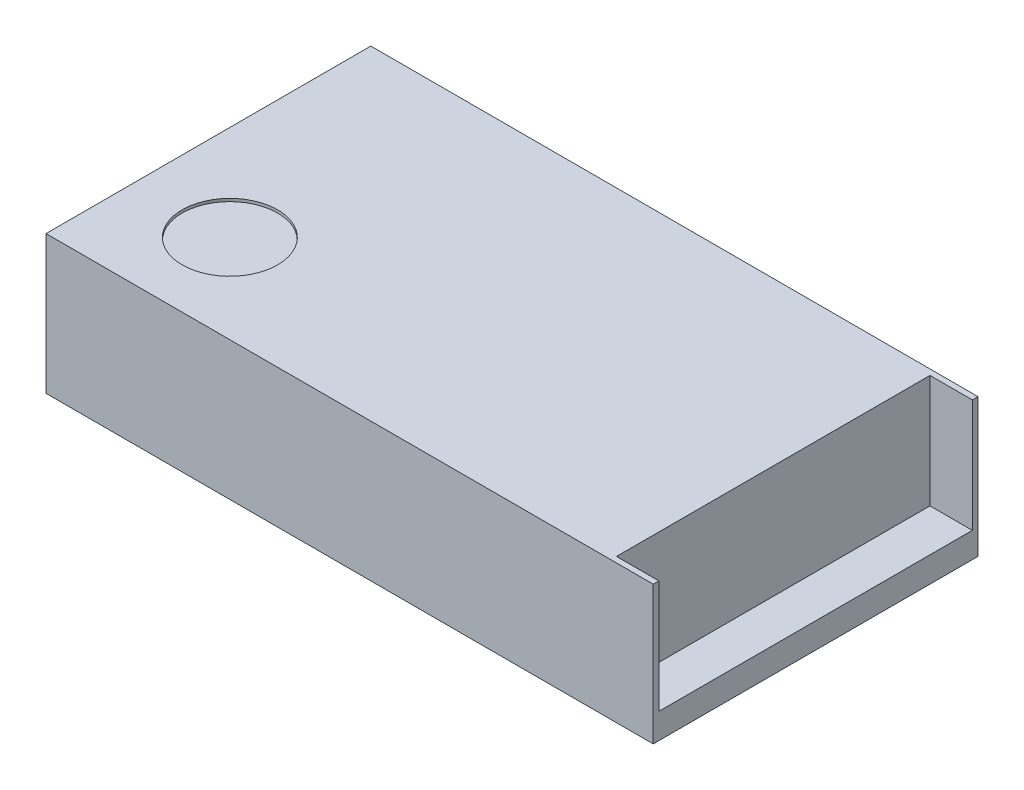
ISO-10303-21;
HEADER;
FILE_DESCRIPTION(('STEP AP214'),'2;1');
FILE_NAME('part.step','',(''),(''),'','','');
FILE_SCHEMA(('AUTOMOTIVE_DESIGN { 1 0 10303 214 1 1 1 1 }'));
ENDSEC;
DATA;
#1=APPLICATION_CONTEXT('core data for automotive mechanical design processes');
#2=APPLICATION_PROTOCOL_DEFINITION('international standard','automotive_design',2000,#1);
#3=PRODUCT_CONTEXT('',#1,'mechanical');
#4=PRODUCT('Part','Part','',(#3));
#5=PRODUCT_RELATED_PRODUCT_CATEGORY('part','',(#4));
#6=PRODUCT_DEFINITION_FORMATION('','',#4);
#7=PRODUCT_DEFINITION_CONTEXT('part definition',#1,'design');
#8=PRODUCT_DEFINITION('design','',#6,#7);
#9=PRODUCT_DEFINITION_SHAPE('','',#8);
#10=(LENGTH_UNIT() NAMED_UNIT(*) SI_UNIT(.MILLI.,.METRE.));
#11=(NAMED_UNIT(*) PLANE_ANGLE_UNIT() SI_UNIT($,.RADIAN.));
#12=(NAMED_UNIT(*) SI_UNIT($,.STERADIAN.) SOLID_ANGLE_UNIT());
#13=UNCERTAINTY_MEASURE_WITH_UNIT(LENGTH_MEASURE(1.E-05),#10,'distance_accuracy_value','');
#14=(GEOMETRIC_REPRESENTATION_CONTEXT(3) GLOBAL_UNCERTAINTY_ASSIGNED_CONTEXT((#13)) GLOBAL_UNIT_ASSIGNED_CONTEXT((#10,
#11,#12)) REPRESENTATION_CONTEXT('',''));
#15=CARTESIAN_POINT('',(0.,0.,0.));
#16=DIRECTION('',(0.,0.,1.));
#17=DIRECTION('',(1.,0.,0.));
#18=AXIS2_PLACEMENT_3D('',#15,#16,#17);
#19=CARTESIAN_POINT('',(107.5,49.,57.5));
#20=DIRECTION('',(-1.,0.,0.));
#21=DIRECTION('',(0.,0.,1.));
#22=AXIS2_PLACEMENT_3D('',#19,#20,#21);
#23=PLANE('',#22);
#24=DIRECTION('',(0.,0.,-1.));
#25=VECTOR('',#24,1.);
#26=CARTESIAN_POINT('',(107.5,9.,-55.5));
#27=LINE('',#26,#25);
#28=CARTESIAN_POINT('',(107.5,9.,55.5));
#29=VERTEX_POINT('',#28);
#30=CARTESIAN_POINT('',(107.5,9.,-55.5));
#31=VERTEX_POINT('',#30);
#32=EDGE_CURVE('E119',#29,#31,#27,.T.);
#33=ORIENTED_EDGE('',*,*,#32,.F.);
#34=DIRECTION('',(0.,1.,0.));
#35=VECTOR('',#34,1.);
#36=CARTESIAN_POINT('',(107.5,9.,55.5));
#37=LINE('',#36,#35);
#38=CARTESIAN_POINT('',(107.5,49.,55.5));
#39=VERTEX_POINT('',#38);
#40=EDGE_CURVE('E144',#29,#39,#37,.T.);
#41=ORIENTED_EDGE('',*,*,#40,.T.);
#42=DIRECTION('',(0.,0.,-1.));
#43=VECTOR('',#42,1.);
#44=CARTESIAN_POINT('',(107.5,49.,57.5));
#45=LINE('',#44,#43);
#46=CARTESIAN_POINT('',(107.5,49.,57.5));
#47=VERTEX_POINT('',#46);
#48=EDGE_CURVE('E145',#47,#39,#45,.T.);
#49=ORIENTED_EDGE('',*,*,#48,.F.);
#50=DIRECTION('',(0.,-1.,0.));
#51=VECTOR('',#50,1.);
#52=CARTESIAN_POINT('',(107.5,49.,57.5));
#53=LINE('',#52,#51);
#54=CARTESIAN_POINT('',(107.5,0.,57.5));
#55=VERTEX_POINT('',#54);
#56=EDGE_CURVE('E152',#47,#55,#53,.T.);
#57=ORIENTED_EDGE('',*,*,#56,.T.);
#58=DIRECTION('',(0.,0.,-1.));
#59=VECTOR('',#58,1.);
#60=CARTESIAN_POINT('',(107.5,0.,57.5));
#61=LINE('',#60,#59);
#62=CARTESIAN_POINT('',(107.5,0.,-57.5));
#63=VERTEX_POINT('',#62);
#64=EDGE_CURVE('E140',#55,#63,#61,.T.);
#65=ORIENTED_EDGE('',*,*,#64,.T.);
#66=DIRECTION('',(0.,-1.,0.));
#67=VECTOR('',#66,1.);
#68=CARTESIAN_POINT('',(107.5,49.,-57.5));
#69=LINE('',#68,#67);
#70=CARTESIAN_POINT('',(107.5,49.,-57.5));
#71=VERTEX_POINT('',#70);
#72=EDGE_CURVE('E11',#71,#63,#69,.T.);
#73=ORIENTED_EDGE('',*,*,#72,.F.);
#74=CARTESIAN_POINT('',(107.5,49.,-55.5));
#75=VERTEX_POINT('',#74);
#76=EDGE_CURVE('E89',#75,#71,#45,.T.);
#77=ORIENTED_EDGE('',*,*,#76,.F.);
#78=DIRECTION('',(0.,1.,0.));
#79=VECTOR('',#78,1.);
#80=CARTESIAN_POINT('',(107.5,9.,-55.5));
#81=LINE('',#80,#79);
#82=EDGE_CURVE('E53',#31,#75,#81,.T.);
#83=ORIENTED_EDGE('',*,*,#82,.F.);
#84=EDGE_LOOP('',(#33,#41,#49,#57,#65,#73,#77,#83));
#85=FACE_BOUND('',#84,.T.);
#86=ADVANCED_FACE('F39',(#85),#23,.F.);
#87=CARTESIAN_POINT('',(-107.5,49.,-57.5));
#88=DIRECTION('',(0.,0.,1.));
#89=DIRECTION('',(1.,0.,0.));
#90=AXIS2_PLACEMENT_3D('',#87,#88,#89);
#91=PLANE('',#90);
#92=DIRECTION('',(-1.,0.,0.));
#93=VECTOR('',#92,1.);
#94=CARTESIAN_POINT('',(-107.5,0.,-57.5));
#95=LINE('',#94,#93);
#96=CARTESIAN_POINT('',(-107.5,0.,-57.5));
#97=VERTEX_POINT('',#96);
#98=EDGE_CURVE('E155',#63,#97,#95,.T.);
#99=ORIENTED_EDGE('',*,*,#98,.T.);
#100=DIRECTION('',(0.,-1.,0.));
#101=VECTOR('',#100,1.);
#102=CARTESIAN_POINT('',(-107.5,49.,-57.5));
#103=LINE('',#102,#101);
#104=CARTESIAN_POINT('',(-107.5,49.,-57.5));
#105=VERTEX_POINT('',#104);
#106=EDGE_CURVE('E46',#105,#97,#103,.T.);
#107=ORIENTED_EDGE('',*,*,#106,.F.);
#108=DIRECTION('',(-1.,0.,0.));
#109=VECTOR('',#108,1.);
#110=CARTESIAN_POINT('',(-107.5,49.,-57.5));
#111=LINE('',#110,#109);
#112=EDGE_CURVE('E147',#71,#105,#111,.T.);
#113=ORIENTED_EDGE('',*,*,#112,.F.);
#114=ORIENTED_EDGE('',*,*,#72,.T.);
#115=EDGE_LOOP('',(#99,#107,#113,#114));
#116=FACE_BOUND('',#115,.T.);
#117=ADVANCED_FACE('F185',(#116),#91,.F.);
#118=CARTESIAN_POINT('',(-107.5,49.,57.5));
#119=DIRECTION('',(1.,0.,0.));
#120=DIRECTION('',(0.,0.,-1.));
#121=AXIS2_PLACEMENT_3D('',#118,#119,#120);
#122=PLANE('',#121);
#123=DIRECTION('',(0.,0.,1.));
#124=VECTOR('',#123,1.);
#125=CARTESIAN_POINT('',(-107.5,0.,57.5));
#126=LINE('',#125,#124);
#127=CARTESIAN_POINT('',(-107.5,0.,57.5));
#128=VERTEX_POINT('',#127);
#129=EDGE_CURVE('E157',#97,#128,#126,.T.);
#130=ORIENTED_EDGE('',*,*,#129,.T.);
#131=DIRECTION('',(0.,-1.,0.));
#132=VECTOR('',#131,1.);
#133=CARTESIAN_POINT('',(-107.5,49.,57.5));
#134=LINE('',#133,#132);
#135=CARTESIAN_POINT('',(-107.5,49.,57.5));
#136=VERTEX_POINT('',#135);
#137=EDGE_CURVE('E161',#136,#128,#134,.T.);
#138=ORIENTED_EDGE('',*,*,#137,.F.);
#139=DIRECTION('',(0.,0.,1.));
#140=VECTOR('',#139,1.);
#141=CARTESIAN_POINT('',(-107.5,49.,57.5));
#142=LINE('',#141,#140);
#143=EDGE_CURVE('E149',#105,#136,#142,.T.);
#144=ORIENTED_EDGE('',*,*,#143,.F.);
#145=ORIENTED_EDGE('',*,*,#106,.T.);
#146=EDGE_LOOP('',(#130,#138,#144,#145));
#147=FACE_BOUND('',#146,.T.);
#148=ADVANCED_FACE('F167',(#147),#122,.F.);
#149=CARTESIAN_POINT('',(-107.5,49.,57.5));
#150=DIRECTION('',(0.,0.,-1.));
#151=DIRECTION('',(-1.,0.,0.));
#152=AXIS2_PLACEMENT_3D('',#149,#150,#151);
#153=PLANE('',#152);
#154=DIRECTION('',(1.,0.,0.));
#155=VECTOR('',#154,1.);
#156=CARTESIAN_POINT('',(-107.5,0.,57.5));
#157=LINE('',#156,#155);
#158=EDGE_CURVE('E83',#128,#55,#157,.T.);
#159=ORIENTED_EDGE('',*,*,#158,.T.);
#160=ORIENTED_EDGE('',*,*,#56,.F.);
#161=DIRECTION('',(1.,0.,0.));
#162=VECTOR('',#161,1.);
#163=CARTESIAN_POINT('',(-107.5,49.,57.5));
#164=LINE('',#163,#162);
#165=EDGE_CURVE('E62',#136,#47,#164,.T.);
#166=ORIENTED_EDGE('',*,*,#165,.F.);
#167=ORIENTED_EDGE('',*,*,#137,.T.);
#168=EDGE_LOOP('',(#159,#160,#166,#167));
#169=FACE_BOUND('',#168,.T.);
#170=ADVANCED_FACE('F174',(#169),#153,.F.);
#171=CARTESIAN_POINT('',(0.,49.,0.));
#172=DIRECTION('',(0.,-1.,0.));
#173=DIRECTION('',(0.,0.,-1.));
#174=AXIS2_PLACEMENT_3D('',#171,#172,#173);
#175=PLANE('',#174);
#176=CARTESIAN_POINT('',(-73.7947598253275,49.,26.1004366812225));
#177=DIRECTION('',(0.,1.,0.));
#178=DIRECTION('',(0.,0.,1.));
#179=AXIS2_PLACEMENT_3D('',#176,#177,#178);
#180=CIRCLE('',#179,16.8995633187773);
#181=CARTESIAN_POINT('',(-73.7947598253275,49.,42.9999999999997));
#182=VERTEX_POINT('',#181);
#183=EDGE_CURVE('E141',#182,#182,#180,.T.);
#184=ORIENTED_EDGE('',*,*,#183,.F.);
#185=EDGE_LOOP('',(#184));
#186=FACE_BOUND('',#185,.T.);
#187=ORIENTED_EDGE('',*,*,#48,.T.);
#188=DIRECTION('',(1.,0.,0.));
#189=VECTOR('',#188,1.);
#190=CARTESIAN_POINT('',(107.5,49.,55.5));
#191=LINE('',#190,#189);
#192=CARTESIAN_POINT('',(92.5,49.,55.5));
#193=VERTEX_POINT('',#192);
#194=EDGE_CURVE('E128',#193,#39,#191,.T.);
#195=ORIENTED_EDGE('',*,*,#194,.F.);
#196=DIRECTION('',(0.,0.,1.));
#197=VECTOR('',#196,1.);
#198=CARTESIAN_POINT('',(92.5,49.,-55.5));
#199=LINE('',#198,#197);
#200=CARTESIAN_POINT('',(92.5,49.,-55.5));
#201=VERTEX_POINT('',#200);
#202=EDGE_CURVE('E198',#201,#193,#199,.T.);
#203=ORIENTED_EDGE('',*,*,#202,.F.);
#204=DIRECTION('',(-1.,0.,0.));
#205=VECTOR('',#204,1.);
#206=CARTESIAN_POINT('',(107.5,49.,-55.5));
#207=LINE('',#206,#205);
#208=EDGE_CURVE('E201',#75,#201,#207,.T.);
#209=ORIENTED_EDGE('',*,*,#208,.F.);
#210=ORIENTED_EDGE('',*,*,#76,.T.);
#211=ORIENTED_EDGE('',*,*,#112,.T.);
#212=ORIENTED_EDGE('',*,*,#143,.T.);
#213=ORIENTED_EDGE('',*,*,#165,.T.);
#214=EDGE_LOOP('',(#187,#195,#203,#209,#210,#211,#212,#213));
#215=FACE_BOUND('',#214,.T.);
#216=ADVANCED_FACE('F176',(#186,#215),#175,.F.);
#217=CARTESIAN_POINT('',(0.,0.,0.));
#218=DIRECTION('',(0.,-1.,0.));
#219=DIRECTION('',(0.,0.,-1.));
#220=AXIS2_PLACEMENT_3D('',#217,#218,#219);
#221=PLANE('',#220);
#222=ORIENTED_EDGE('',*,*,#64,.F.);
#223=ORIENTED_EDGE('',*,*,#158,.F.);
#224=ORIENTED_EDGE('',*,*,#129,.F.);
#225=ORIENTED_EDGE('',*,*,#98,.F.);
#226=EDGE_LOOP('',(#222,#223,#224,#225));
#227=FACE_BOUND('',#226,.T.);
#228=ADVANCED_FACE('F172',(#227),#221,.T.);
#229=CARTESIAN_POINT('',(-73.7947598253275,48.,26.1004366812225));
#230=DIRECTION('',(0.,1.,0.));
#231=DIRECTION('',(0.,0.,1.));
#232=AXIS2_PLACEMENT_3D('',#229,#230,#231);
#233=CYLINDRICAL_SURFACE('',#232,16.8995633187773);
#234=CARTESIAN_POINT('',(-73.7947598253275,48.,26.1004366812225));
#235=DIRECTION('',(0.,1.,0.));
#236=DIRECTION('',(0.,0.,1.));
#237=AXIS2_PLACEMENT_3D('',#234,#235,#236);
#238=CIRCLE('',#237,16.8995633187773);
#239=CARTESIAN_POINT('',(-73.7947598253275,48.,42.9999999999997));
#240=VERTEX_POINT('',#239);
#241=EDGE_CURVE('E137',#240,#240,#238,.T.);
#242=ORIENTED_EDGE('',*,*,#241,.F.);
#243=EDGE_LOOP('',(#242));
#244=FACE_BOUND('',#243,.T.);
#245=ORIENTED_EDGE('',*,*,#183,.T.);
#246=EDGE_LOOP('',(#245));
#247=FACE_BOUND('',#246,.T.);
#248=ADVANCED_FACE('F221',(#244,#247),#233,.F.);
#249=CARTESIAN_POINT('',(-73.7947598253275,48.,26.1004366812225));
#250=DIRECTION('',(0.,1.,0.));
#251=DIRECTION('',(0.,0.,1.));
#252=AXIS2_PLACEMENT_3D('',#249,#250,#251);
#253=PLANE('',#252);
#254=ORIENTED_EDGE('',*,*,#241,.T.);
#255=EDGE_LOOP('',(#254));
#256=FACE_BOUND('',#255,.T.);
#257=ADVANCED_FACE('F216',(#256),#253,.T.);
#258=CARTESIAN_POINT('',(107.5,9.,55.5));
#259=DIRECTION('',(0.,0.,1.));
#260=DIRECTION('',(1.,0.,0.));
#261=AXIS2_PLACEMENT_3D('',#258,#259,#260);
#262=PLANE('',#261);
#263=ORIENTED_EDGE('',*,*,#194,.T.);
#264=ORIENTED_EDGE('',*,*,#40,.F.);
#265=DIRECTION('',(1.,0.,0.));
#266=VECTOR('',#265,1.);
#267=CARTESIAN_POINT('',(107.5,9.,55.5));
#268=LINE('',#267,#266);
#269=CARTESIAN_POINT('',(92.5,9.,55.5));
#270=VERTEX_POINT('',#269);
#271=EDGE_CURVE('E125',#270,#29,#268,.T.);
#272=ORIENTED_EDGE('',*,*,#271,.F.);
#273=DIRECTION('',(0.,1.,0.));
#274=VECTOR('',#273,1.);
#275=CARTESIAN_POINT('',(92.5,9.,55.5));
#276=LINE('',#275,#274);
#277=EDGE_CURVE('E132',#270,#193,#276,.T.);
#278=ORIENTED_EDGE('',*,*,#277,.T.);
#279=EDGE_LOOP('',(#263,#264,#272,#278));
#280=FACE_BOUND('',#279,.T.);
#281=ADVANCED_FACE('F205',(#280),#262,.F.);
#282=CARTESIAN_POINT('',(92.5,9.,-55.5));
#283=DIRECTION('',(-1.,0.,0.));
#284=DIRECTION('',(0.,0.,1.));
#285=AXIS2_PLACEMENT_3D('',#282,#283,#284);
#286=PLANE('',#285);
#287=ORIENTED_EDGE('',*,*,#202,.T.);
#288=ORIENTED_EDGE('',*,*,#277,.F.);
#289=DIRECTION('',(0.,0.,1.));
#290=VECTOR('',#289,1.);
#291=CARTESIAN_POINT('',(92.5,9.,-55.5));
#292=LINE('',#291,#290);
#293=CARTESIAN_POINT('',(92.5,9.,-55.5));
#294=VERTEX_POINT('',#293);
#295=EDGE_CURVE('E118',#294,#270,#292,.T.);
#296=ORIENTED_EDGE('',*,*,#295,.F.);
#297=DIRECTION('',(0.,1.,0.));
#298=VECTOR('',#297,1.);
#299=CARTESIAN_POINT('',(92.5,9.,-55.5));
#300=LINE('',#299,#298);
#301=EDGE_CURVE('E114',#294,#201,#300,.T.);
#302=ORIENTED_EDGE('',*,*,#301,.T.);
#303=EDGE_LOOP('',(#287,#288,#296,#302));
#304=FACE_BOUND('',#303,.T.);
#305=ADVANCED_FACE('F207',(#304),#286,.F.);
#306=CARTESIAN_POINT('',(107.5,9.,-55.5));
#307=DIRECTION('',(0.,0.,-1.));
#308=DIRECTION('',(-1.,0.,0.));
#309=AXIS2_PLACEMENT_3D('',#306,#307,#308);
#310=PLANE('',#309);
#311=ORIENTED_EDGE('',*,*,#208,.T.);
#312=ORIENTED_EDGE('',*,*,#301,.F.);
#313=DIRECTION('',(-1.,0.,0.));
#314=VECTOR('',#313,1.);
#315=CARTESIAN_POINT('',(107.5,9.,-55.5));
#316=LINE('',#315,#314);
#317=EDGE_CURVE('E111',#31,#294,#316,.T.);
#318=ORIENTED_EDGE('',*,*,#317,.F.);
#319=ORIENTED_EDGE('',*,*,#82,.T.);
#320=EDGE_LOOP('',(#311,#312,#318,#319));
#321=FACE_BOUND('',#320,.T.);
#322=ADVANCED_FACE('F113',(#321),#310,.F.);
#323=CARTESIAN_POINT('',(0.,9.,0.));
#324=DIRECTION('',(0.,-1.,0.));
#325=DIRECTION('',(0.,0.,-1.));
#326=AXIS2_PLACEMENT_3D('',#323,#324,#325);
#327=PLANE('',#326);
#328=ORIENTED_EDGE('',*,*,#32,.T.);
#329=ORIENTED_EDGE('',*,*,#317,.T.);
#330=ORIENTED_EDGE('',*,*,#295,.T.);
#331=ORIENTED_EDGE('',*,*,#271,.T.);
#332=EDGE_LOOP('',(#328,#329,#330,#331));
#333=FACE_BOUND('',#332,.T.);
#334=ADVANCED_FACE('F123',(#333),#327,.F.);
#335=CLOSED_SHELL('',(#86,#117,#148,#170,#216,#228,#248,#257,#281,#305,#322,#334));
#336=MANIFOLD_SOLID_BREP('B2',#335);
#337=ADVANCED_BREP_SHAPE_REPRESENTATION('',(#18,#336),#14);
#338=SHAPE_DEFINITION_REPRESENTATION(#9,#337);
ENDSEC;
END-ISO-10303-21;
